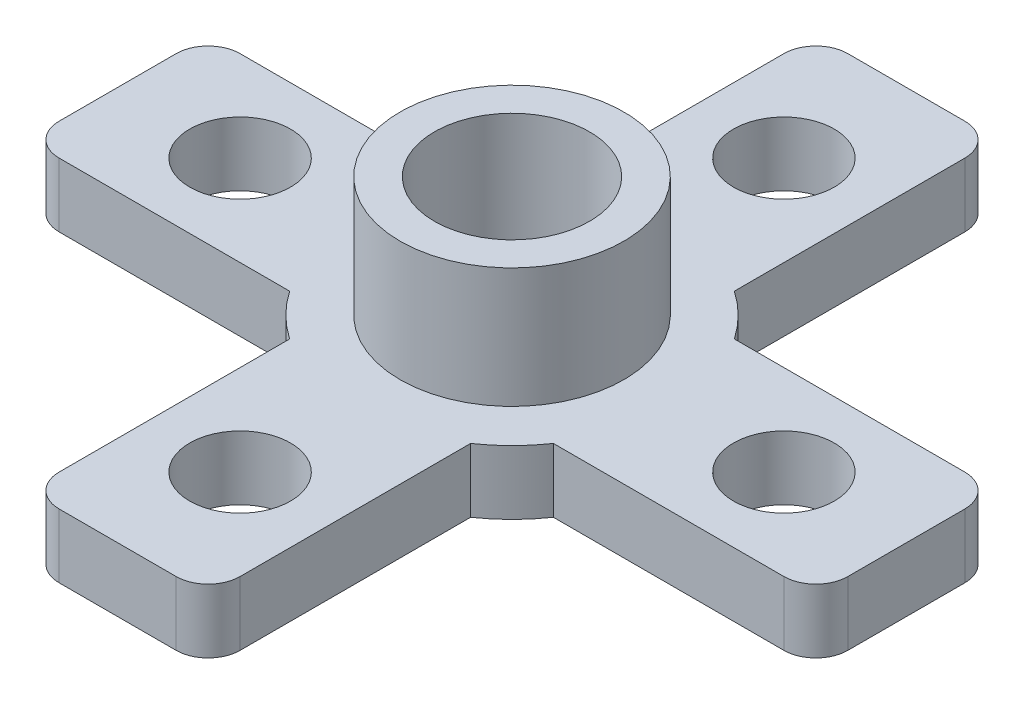
ISO-10303-21;
HEADER;
FILE_DESCRIPTION(('STEP AP214'),'2;1');
FILE_NAME('part.step','',(''),(''),'','','');
FILE_SCHEMA(('AUTOMOTIVE_DESIGN { 1 0 10303 214 1 1 1 1 }'));
ENDSEC;
DATA;
#1=APPLICATION_CONTEXT('core data for automotive mechanical design processes');
#2=APPLICATION_PROTOCOL_DEFINITION('international standard','automotive_design',2000,#1);
#3=PRODUCT_CONTEXT('',#1,'mechanical');
#4=PRODUCT('Part','Part','',(#3));
#5=PRODUCT_RELATED_PRODUCT_CATEGORY('part','',(#4));
#6=PRODUCT_DEFINITION_FORMATION('','',#4);
#7=PRODUCT_DEFINITION_CONTEXT('part definition',#1,'design');
#8=PRODUCT_DEFINITION('design','',#6,#7);
#9=PRODUCT_DEFINITION_SHAPE('','',#8);
#10=(LENGTH_UNIT() NAMED_UNIT(*) SI_UNIT(.MILLI.,.METRE.));
#11=(NAMED_UNIT(*) PLANE_ANGLE_UNIT() SI_UNIT($,.RADIAN.));
#12=(NAMED_UNIT(*) SI_UNIT($,.STERADIAN.) SOLID_ANGLE_UNIT());
#13=UNCERTAINTY_MEASURE_WITH_UNIT(LENGTH_MEASURE(1.E-05),#10,'distance_accuracy_value','');
#14=(GEOMETRIC_REPRESENTATION_CONTEXT(3) GLOBAL_UNCERTAINTY_ASSIGNED_CONTEXT((#13)) GLOBAL_UNIT_ASSIGNED_CONTEXT((#10,
#11,#12)) REPRESENTATION_CONTEXT('',''));
#15=CARTESIAN_POINT('',(0.,0.,0.));
#16=DIRECTION('',(0.,0.,1.));
#17=DIRECTION('',(1.,0.,0.));
#18=AXIS2_PLACEMENT_3D('',#15,#16,#17);
#19=CARTESIAN_POINT('',(0.,2.,0.));
#20=DIRECTION('',(0.,-1.,0.));
#21=DIRECTION('',(0.,0.,-1.));
#22=AXIS2_PLACEMENT_3D('',#19,#20,#21);
#23=CYLINDRICAL_SURFACE('',#22,3.);
#24=CARTESIAN_POINT('',(0.,1.,0.));
#25=DIRECTION('',(0.,1.,0.));
#26=DIRECTION('',(0.,0.,1.));
#27=AXIS2_PLACEMENT_3D('',#24,#25,#26);
#28=CIRCLE('',#27,3.);
#29=CARTESIAN_POINT('',(0.,1.,3.));
#30=VERTEX_POINT('',#29);
#31=EDGE_CURVE('E108',#30,#30,#28,.T.);
#32=ORIENTED_EDGE('',*,*,#31,.T.);
#33=EDGE_LOOP('',(#32));
#34=FACE_BOUND('',#33,.T.);
#35=CARTESIAN_POINT('',(0.,2.,0.));
#36=DIRECTION('',(0.,1.,0.));
#37=DIRECTION('',(0.,0.,1.));
#38=AXIS2_PLACEMENT_3D('',#35,#36,#37);
#39=CIRCLE('',#38,3.);
#40=CARTESIAN_POINT('',(0.,2.,3.));
#41=VERTEX_POINT('',#40);
#42=EDGE_CURVE('E104',#41,#41,#39,.T.);
#43=ORIENTED_EDGE('',*,*,#42,.F.);
#44=EDGE_LOOP('',(#43));
#45=FACE_BOUND('',#44,.T.);
#46=ADVANCED_FACE('F98',(#34,#45),#23,.T.);
#47=CARTESIAN_POINT('',(0.,2.,0.));
#48=DIRECTION('',(0.,-1.,0.));
#49=DIRECTION('',(0.,0.,-1.));
#50=AXIS2_PLACEMENT_3D('',#47,#48,#49);
#51=CYLINDRICAL_SURFACE('',#50,1.125);
#52=CARTESIAN_POINT('',(0.,1.,0.));
#53=DIRECTION('',(0.,1.,0.));
#54=DIRECTION('',(0.,0.,1.));
#55=AXIS2_PLACEMENT_3D('',#52,#53,#54);
#56=CIRCLE('',#55,1.125);
#57=CARTESIAN_POINT('',(0.,1.,1.125));
#58=VERTEX_POINT('',#57);
#59=EDGE_CURVE('E112',#58,#58,#56,.T.);
#60=ORIENTED_EDGE('',*,*,#59,.F.);
#61=EDGE_LOOP('',(#60));
#62=FACE_BOUND('',#61,.T.);
#63=CARTESIAN_POINT('',(0.,2.,0.));
#64=DIRECTION('',(0.,1.,0.));
#65=DIRECTION('',(0.,0.,1.));
#66=AXIS2_PLACEMENT_3D('',#63,#64,#65);
#67=CIRCLE('',#66,1.125);
#68=CARTESIAN_POINT('',(0.,2.,1.125));
#69=VERTEX_POINT('',#68);
#70=EDGE_CURVE('E12',#69,#69,#67,.T.);
#71=ORIENTED_EDGE('',*,*,#70,.T.);
#72=EDGE_LOOP('',(#71));
#73=FACE_BOUND('',#72,.T.);
#74=ADVANCED_FACE('F121',(#62,#73),#51,.F.);
#75=CARTESIAN_POINT('',(0.,2.,0.));
#76=DIRECTION('',(0.,1.,0.));
#77=DIRECTION('',(0.,0.,1.));
#78=AXIS2_PLACEMENT_3D('',#75,#76,#77);
#79=PLANE('',#78);
#80=ORIENTED_EDGE('',*,*,#42,.T.);
#81=EDGE_LOOP('',(#80));
#82=FACE_BOUND('',#81,.T.);
#83=ORIENTED_EDGE('',*,*,#70,.F.);
#84=EDGE_LOOP('',(#83));
#85=FACE_BOUND('',#84,.T.);
#86=ADVANCED_FACE('F123',(#82,#85),#79,.T.);
#87=CARTESIAN_POINT('',(0.,1.,0.));
#88=DIRECTION('',(0.,1.,0.));
#89=DIRECTION('',(0.,0.,1.));
#90=AXIS2_PLACEMENT_3D('',#87,#88,#89);
#91=PLANE('',#90);
#92=ORIENTED_EDGE('',*,*,#59,.T.);
#93=EDGE_LOOP('',(#92));
#94=FACE_BOUND('',#93,.T.);
#95=ORIENTED_EDGE('',*,*,#31,.F.);
#96=EDGE_LOOP('',(#95));
#97=FACE_BOUND('',#96,.T.);
#98=ADVANCED_FACE('F118',(#94,#97),#91,.F.);
#99=CLOSED_SHELL('',(#46,#74,#86,#98));
#100=MANIFOLD_SOLID_BREP('B2',#99);
#101=CARTESIAN_POINT('',(0.,2.,0.));
#102=DIRECTION('',(0.,-1.,0.));
#103=DIRECTION('',(0.,0.,-1.));
#104=AXIS2_PLACEMENT_3D('',#101,#102,#103);
#105=CYLINDRICAL_SURFACE('',#104,5.);
#106=CARTESIAN_POINT('',(0.,0.,0.));
#107=DIRECTION('',(0.,1.,0.));
#108=DIRECTION('',(0.,0.,1.));
#109=AXIS2_PLACEMENT_3D('',#106,#107,#108);
#110=CIRCLE('',#109,5.);
#111=CARTESIAN_POINT('',(-2.82842712474619,0.,-4.12310562561766));
#112=VERTEX_POINT('',#111);
#113=CARTESIAN_POINT('',(-4.12310562561766,0.,-2.82842712474619));
#114=VERTEX_POINT('',#113);
#115=EDGE_CURVE('E385',#112,#114,#110,.T.);
#116=ORIENTED_EDGE('',*,*,#115,.T.);
#117=DIRECTION('',(0.,-1.,0.));
#118=VECTOR('',#117,1.);
#119=CARTESIAN_POINT('',(-4.12310562561766,2.,-2.82842712474619));
#120=LINE('',#119,#118);
#121=CARTESIAN_POINT('',(-4.12310562561766,2.,-2.82842712474619));
#122=VERTEX_POINT('',#121);
#123=EDGE_CURVE('E368',#122,#114,#120,.T.);
#124=ORIENTED_EDGE('',*,*,#123,.F.);
#125=CARTESIAN_POINT('',(0.,2.,0.));
#126=DIRECTION('',(0.,1.,0.));
#127=DIRECTION('',(0.,0.,1.));
#128=AXIS2_PLACEMENT_3D('',#125,#126,#127);
#129=CIRCLE('',#128,5.);
#130=CARTESIAN_POINT('',(-2.82842712474619,2.,-4.12310562561766));
#131=VERTEX_POINT('',#130);
#132=EDGE_CURVE('E374',#131,#122,#129,.T.);
#133=ORIENTED_EDGE('',*,*,#132,.F.);
#134=DIRECTION('',(0.,-1.,0.));
#135=VECTOR('',#134,1.);
#136=CARTESIAN_POINT('',(-2.82842712474619,2.,-4.12310562561766));
#137=LINE('',#136,#135);
#138=EDGE_CURVE('E525',#131,#112,#137,.T.);
#139=ORIENTED_EDGE('',*,*,#138,.T.);
#140=EDGE_LOOP('',(#116,#124,#133,#139));
#141=FACE_BOUND('',#140,.T.);
#142=ADVANCED_FACE('F199',(#141),#105,.T.);
#143=CARTESIAN_POINT('',(0.,2.,-2.82842712474619));
#144=DIRECTION('',(0.,0.,-1.));
#145=DIRECTION('',(-1.,0.,0.));
#146=AXIS2_PLACEMENT_3D('',#143,#144,#145);
#147=PLANE('',#146);
#148=DIRECTION('',(1.,0.,0.));
#149=VECTOR('',#148,1.);
#150=CARTESIAN_POINT('',(0.,0.,-2.82842712474619));
#151=LINE('',#150,#149);
#152=CARTESIAN_POINT('',(-11.3284271247462,0.,-2.82842712474619));
#153=VERTEX_POINT('',#152);
#154=EDGE_CURVE('E559',#153,#114,#151,.T.);
#155=ORIENTED_EDGE('',*,*,#154,.F.);
#156=DIRECTION('',(0.,-1.,0.));
#157=VECTOR('',#156,1.);
#158=CARTESIAN_POINT('',(-11.3284271247462,2.,-2.82842712474619));
#159=LINE('',#158,#157);
#160=CARTESIAN_POINT('',(-11.3284271247462,2.,-2.82842712474619));
#161=VERTEX_POINT('',#160);
#162=EDGE_CURVE('E371',#153,#161,#159,.F.);
#163=ORIENTED_EDGE('',*,*,#162,.T.);
#164=DIRECTION('',(1.,0.,0.));
#165=VECTOR('',#164,1.);
#166=CARTESIAN_POINT('',(0.,2.,-2.82842712474619));
#167=LINE('',#166,#165);
#168=EDGE_CURVE('E363',#161,#122,#167,.T.);
#169=ORIENTED_EDGE('',*,*,#168,.T.);
#170=ORIENTED_EDGE('',*,*,#123,.T.);
#171=EDGE_LOOP('',(#155,#163,#169,#170));
#172=FACE_BOUND('',#171,.T.);
#173=ADVANCED_FACE('F366',(#172),#147,.T.);
#174=CARTESIAN_POINT('',(-12.3284271247462,2.,0.));
#175=DIRECTION('',(-1.,0.,0.));
#176=DIRECTION('',(0.,0.,1.));
#177=AXIS2_PLACEMENT_3D('',#174,#175,#176);
#178=PLANE('',#177);
#179=DIRECTION('',(0.,0.,-1.));
#180=VECTOR('',#179,1.);
#181=CARTESIAN_POINT('',(-12.3284271247462,2.,0.));
#182=LINE('',#181,#180);
#183=CARTESIAN_POINT('',(-12.3284271247462,2.,1.82842712474619));
#184=VERTEX_POINT('',#183);
#185=CARTESIAN_POINT('',(-12.3284271247462,2.,-1.82842712474619));
#186=VERTEX_POINT('',#185);
#187=EDGE_CURVE('E373',#184,#186,#182,.T.);
#188=ORIENTED_EDGE('',*,*,#187,.T.);
#189=DIRECTION('',(0.,-1.,0.));
#190=VECTOR('',#189,1.);
#191=CARTESIAN_POINT('',(-12.3284271247462,2.,-1.82842712474619));
#192=LINE('',#191,#190);
#193=CARTESIAN_POINT('',(-12.3284271247462,0.,-1.82842712474619));
#194=VERTEX_POINT('',#193);
#195=EDGE_CURVE('E442',#186,#194,#192,.T.);
#196=ORIENTED_EDGE('',*,*,#195,.T.);
#197=DIRECTION('',(0.,0.,-1.));
#198=VECTOR('',#197,1.);
#199=CARTESIAN_POINT('',(-12.3284271247462,0.,0.));
#200=LINE('',#199,#198);
#201=CARTESIAN_POINT('',(-12.3284271247462,0.,1.82842712474619));
#202=VERTEX_POINT('',#201);
#203=EDGE_CURVE('E554',#202,#194,#200,.T.);
#204=ORIENTED_EDGE('',*,*,#203,.F.);
#205=DIRECTION('',(0.,-1.,0.));
#206=VECTOR('',#205,1.);
#207=CARTESIAN_POINT('',(-12.3284271247462,2.,1.82842712474619));
#208=LINE('',#207,#206);
#209=EDGE_CURVE('E440',#202,#184,#208,.F.);
#210=ORIENTED_EDGE('',*,*,#209,.T.);
#211=EDGE_LOOP('',(#188,#196,#204,#210));
#212=FACE_BOUND('',#211,.T.);
#213=ADVANCED_FACE('F647',(#212),#178,.T.);
#214=CARTESIAN_POINT('',(0.,2.,2.82842712474619));
#215=DIRECTION('',(0.,0.,1.));
#216=DIRECTION('',(1.,0.,0.));
#217=AXIS2_PLACEMENT_3D('',#214,#215,#216);
#218=PLANE('',#217);
#219=DIRECTION('',(-1.,0.,0.));
#220=VECTOR('',#219,1.);
#221=CARTESIAN_POINT('',(0.,2.,2.82842712474619));
#222=LINE('',#221,#220);
#223=CARTESIAN_POINT('',(-4.12310562561766,2.,2.82842712474619));
#224=VERTEX_POINT('',#223);
#225=CARTESIAN_POINT('',(-11.3284271247462,2.,2.82842712474619));
#226=VERTEX_POINT('',#225);
#227=EDGE_CURVE('E600',#224,#226,#222,.T.);
#228=ORIENTED_EDGE('',*,*,#227,.T.);
#229=DIRECTION('',(0.,-1.,0.));
#230=VECTOR('',#229,1.);
#231=CARTESIAN_POINT('',(-11.3284271247462,2.,2.82842712474619));
#232=LINE('',#231,#230);
#233=CARTESIAN_POINT('',(-11.3284271247462,0.,2.82842712474619));
#234=VERTEX_POINT('',#233);
#235=EDGE_CURVE('E446',#226,#234,#232,.T.);
#236=ORIENTED_EDGE('',*,*,#235,.T.);
#237=DIRECTION('',(-1.,0.,0.));
#238=VECTOR('',#237,1.);
#239=CARTESIAN_POINT('',(0.,0.,2.82842712474619));
#240=LINE('',#239,#238);
#241=CARTESIAN_POINT('',(-4.12310562561766,0.,2.82842712474619));
#242=VERTEX_POINT('',#241);
#243=EDGE_CURVE('E552',#242,#234,#240,.T.);
#244=ORIENTED_EDGE('',*,*,#243,.F.);
#245=DIRECTION('',(0.,-1.,0.));
#246=VECTOR('',#245,1.);
#247=CARTESIAN_POINT('',(-4.12310562561766,2.,2.82842712474619));
#248=LINE('',#247,#246);
#249=EDGE_CURVE('E387',#224,#242,#248,.T.);
#250=ORIENTED_EDGE('',*,*,#249,.F.);
#251=EDGE_LOOP('',(#228,#236,#244,#250));
#252=FACE_BOUND('',#251,.T.);
#253=ADVANCED_FACE('F683',(#252),#218,.T.);
#254=CARTESIAN_POINT('',(0.,2.,0.));
#255=DIRECTION('',(0.,-1.,0.));
#256=DIRECTION('',(0.,0.,-1.));
#257=AXIS2_PLACEMENT_3D('',#254,#255,#256);
#258=CYLINDRICAL_SURFACE('',#257,5.);
#259=CARTESIAN_POINT('',(0.,0.,0.));
#260=DIRECTION('',(0.,1.,0.));
#261=DIRECTION('',(0.,0.,1.));
#262=AXIS2_PLACEMENT_3D('',#259,#260,#261);
#263=CIRCLE('',#262,5.);
#264=CARTESIAN_POINT('',(-2.82842712474619,0.,4.12310562561766));
#265=VERTEX_POINT('',#264);
#266=EDGE_CURVE('E548',#242,#265,#263,.T.);
#267=ORIENTED_EDGE('',*,*,#266,.T.);
#268=DIRECTION('',(0.,-1.,0.));
#269=VECTOR('',#268,1.);
#270=CARTESIAN_POINT('',(-2.82842712474619,2.,4.12310562561766));
#271=LINE('',#270,#269);
#272=CARTESIAN_POINT('',(-2.82842712474619,2.,4.12310562561766));
#273=VERTEX_POINT('',#272);
#274=EDGE_CURVE('E391',#273,#265,#271,.T.);
#275=ORIENTED_EDGE('',*,*,#274,.F.);
#276=CARTESIAN_POINT('',(0.,2.,0.));
#277=DIRECTION('',(0.,1.,0.));
#278=DIRECTION('',(0.,0.,1.));
#279=AXIS2_PLACEMENT_3D('',#276,#277,#278);
#280=CIRCLE('',#279,5.);
#281=EDGE_CURVE('E598',#224,#273,#280,.T.);
#282=ORIENTED_EDGE('',*,*,#281,.F.);
#283=ORIENTED_EDGE('',*,*,#249,.T.);
#284=EDGE_LOOP('',(#267,#275,#282,#283));
#285=FACE_BOUND('',#284,.T.);
#286=ADVANCED_FACE('F549',(#285),#258,.T.);
#287=CARTESIAN_POINT('',(-2.82842712474619,2.,0.));
#288=DIRECTION('',(-1.,0.,0.));
#289=DIRECTION('',(0.,0.,1.));
#290=AXIS2_PLACEMENT_3D('',#287,#288,#289);
#291=PLANE('',#290);
#292=DIRECTION('',(0.,0.,-1.));
#293=VECTOR('',#292,1.);
#294=CARTESIAN_POINT('',(-2.82842712474619,0.,0.));
#295=LINE('',#294,#293);
#296=CARTESIAN_POINT('',(-2.82842712474619,0.,11.3284271247462));
#297=VERTEX_POINT('',#296);
#298=EDGE_CURVE('E493',#297,#265,#295,.T.);
#299=ORIENTED_EDGE('',*,*,#298,.F.);
#300=DIRECTION('',(0.,-1.,0.));
#301=VECTOR('',#300,1.);
#302=CARTESIAN_POINT('',(-2.82842712474619,2.,11.3284271247462));
#303=LINE('',#302,#301);
#304=CARTESIAN_POINT('',(-2.82842712474619,2.,11.3284271247462));
#305=VERTEX_POINT('',#304);
#306=EDGE_CURVE('E96',#297,#305,#303,.F.);
#307=ORIENTED_EDGE('',*,*,#306,.T.);
#308=DIRECTION('',(0.,0.,-1.));
#309=VECTOR('',#308,1.);
#310=CARTESIAN_POINT('',(-2.82842712474619,2.,0.));
#311=LINE('',#310,#309);
#312=EDGE_CURVE('E474',#305,#273,#311,.T.);
#313=ORIENTED_EDGE('',*,*,#312,.T.);
#314=ORIENTED_EDGE('',*,*,#274,.T.);
#315=EDGE_LOOP('',(#299,#307,#313,#314));
#316=FACE_BOUND('',#315,.T.);
#317=ADVANCED_FACE('F542',(#316),#291,.T.);
#318=CARTESIAN_POINT('',(0.,2.,12.3284271247462));
#319=DIRECTION('',(0.,0.,1.));
#320=DIRECTION('',(1.,0.,0.));
#321=AXIS2_PLACEMENT_3D('',#318,#319,#320);
#322=PLANE('',#321);
#323=DIRECTION('',(-1.,0.,0.));
#324=VECTOR('',#323,1.);
#325=CARTESIAN_POINT('',(0.,0.,12.3284271247462));
#326=LINE('',#325,#324);
#327=CARTESIAN_POINT('',(1.82842712474619,0.,12.3284271247462));
#328=VERTEX_POINT('',#327);
#329=CARTESIAN_POINT('',(-1.82842712474619,0.,12.3284271247462));
#330=VERTEX_POINT('',#329);
#331=EDGE_CURVE('E466',#328,#330,#326,.T.);
#332=ORIENTED_EDGE('',*,*,#331,.F.);
#333=DIRECTION('',(0.,-1.,0.));
#334=VECTOR('',#333,1.);
#335=CARTESIAN_POINT('',(1.82842712474619,2.,12.3284271247462));
#336=LINE('',#335,#334);
#337=CARTESIAN_POINT('',(1.82842712474619,2.,12.3284271247462));
#338=VERTEX_POINT('',#337);
#339=EDGE_CURVE('E208',#328,#338,#336,.F.);
#340=ORIENTED_EDGE('',*,*,#339,.T.);
#341=DIRECTION('',(-1.,0.,0.));
#342=VECTOR('',#341,1.);
#343=CARTESIAN_POINT('',(0.,2.,12.3284271247462));
#344=LINE('',#343,#342);
#345=CARTESIAN_POINT('',(-1.82842712474619,2.,12.3284271247462));
#346=VERTEX_POINT('',#345);
#347=EDGE_CURVE('E463',#338,#346,#344,.T.);
#348=ORIENTED_EDGE('',*,*,#347,.T.);
#349=DIRECTION('',(0.,-1.,0.));
#350=VECTOR('',#349,1.);
#351=CARTESIAN_POINT('',(-1.82842712474619,2.,12.3284271247462));
#352=LINE('',#351,#350);
#353=EDGE_CURVE('E454',#346,#330,#352,.T.);
#354=ORIENTED_EDGE('',*,*,#353,.T.);
#355=EDGE_LOOP('',(#332,#340,#348,#354));
#356=FACE_BOUND('',#355,.T.);
#357=ADVANCED_FACE('F462',(#356),#322,.T.);
#358=CARTESIAN_POINT('',(2.82842712474619,2.,0.));
#359=DIRECTION('',(1.,0.,0.));
#360=DIRECTION('',(0.,0.,-1.));
#361=AXIS2_PLACEMENT_3D('',#358,#359,#360);
#362=PLANE('',#361);
#363=DIRECTION('',(0.,0.,1.));
#364=VECTOR('',#363,1.);
#365=CARTESIAN_POINT('',(2.82842712474619,2.,0.));
#366=LINE('',#365,#364);
#367=CARTESIAN_POINT('',(2.82842712474619,2.,4.12310562561766));
#368=VERTEX_POINT('',#367);
#369=CARTESIAN_POINT('',(2.82842712474619,2.,11.3284271247462));
#370=VERTEX_POINT('',#369);
#371=EDGE_CURVE('E473',#368,#370,#366,.T.);
#372=ORIENTED_EDGE('',*,*,#371,.T.);
#373=DIRECTION('',(0.,-1.,0.));
#374=VECTOR('',#373,1.);
#375=CARTESIAN_POINT('',(2.82842712474619,2.,11.3284271247462));
#376=LINE('',#375,#374);
#377=CARTESIAN_POINT('',(2.82842712474619,0.,11.3284271247462));
#378=VERTEX_POINT('',#377);
#379=EDGE_CURVE('E451',#370,#378,#376,.T.);
#380=ORIENTED_EDGE('',*,*,#379,.T.);
#381=DIRECTION('',(0.,0.,1.));
#382=VECTOR('',#381,1.);
#383=CARTESIAN_POINT('',(2.82842712474619,0.,0.));
#384=LINE('',#383,#382);
#385=CARTESIAN_POINT('',(2.82842712474619,0.,4.12310562561766));
#386=VERTEX_POINT('',#385);
#387=EDGE_CURVE('E482',#386,#378,#384,.T.);
#388=ORIENTED_EDGE('',*,*,#387,.F.);
#389=DIRECTION('',(0.,-1.,0.));
#390=VECTOR('',#389,1.);
#391=CARTESIAN_POINT('',(2.82842712474619,2.,4.12310562561766));
#392=LINE('',#391,#390);
#393=EDGE_CURVE('E536',#368,#386,#392,.T.);
#394=ORIENTED_EDGE('',*,*,#393,.F.);
#395=EDGE_LOOP('',(#372,#380,#388,#394));
#396=FACE_BOUND('',#395,.T.);
#397=ADVANCED_FACE('F481',(#396),#362,.T.);
#398=CARTESIAN_POINT('',(0.,2.,0.));
#399=DIRECTION('',(0.,-1.,0.));
#400=DIRECTION('',(0.,0.,-1.));
#401=AXIS2_PLACEMENT_3D('',#398,#399,#400);
#402=CYLINDRICAL_SURFACE('',#401,5.);
#403=CARTESIAN_POINT('',(0.,0.,0.));
#404=DIRECTION('',(0.,1.,0.));
#405=DIRECTION('',(0.,0.,1.));
#406=AXIS2_PLACEMENT_3D('',#403,#404,#405);
#407=CIRCLE('',#406,5.);
#408=CARTESIAN_POINT('',(4.12310562561766,0.,2.82842712474619));
#409=VERTEX_POINT('',#408);
#410=EDGE_CURVE('E489',#386,#409,#407,.T.);
#411=ORIENTED_EDGE('',*,*,#410,.T.);
#412=DIRECTION('',(0.,-1.,0.));
#413=VECTOR('',#412,1.);
#414=CARTESIAN_POINT('',(4.12310562561766,2.,2.82842712474619));
#415=LINE('',#414,#413);
#416=CARTESIAN_POINT('',(4.12310562561766,2.,2.82842712474619));
#417=VERTEX_POINT('',#416);
#418=EDGE_CURVE('E533',#417,#409,#415,.T.);
#419=ORIENTED_EDGE('',*,*,#418,.F.);
#420=CARTESIAN_POINT('',(0.,2.,0.));
#421=DIRECTION('',(0.,1.,0.));
#422=DIRECTION('',(0.,0.,1.));
#423=AXIS2_PLACEMENT_3D('',#420,#421,#422);
#424=CIRCLE('',#423,5.);
#425=EDGE_CURVE('E593',#368,#417,#424,.T.);
#426=ORIENTED_EDGE('',*,*,#425,.F.);
#427=ORIENTED_EDGE('',*,*,#393,.T.);
#428=EDGE_LOOP('',(#411,#419,#426,#427));
#429=FACE_BOUND('',#428,.T.);
#430=ADVANCED_FACE('F725',(#429),#402,.T.);
#431=CARTESIAN_POINT('',(0.,2.,2.82842712474619));
#432=DIRECTION('',(0.,0.,1.));
#433=DIRECTION('',(1.,0.,0.));
#434=AXIS2_PLACEMENT_3D('',#431,#432,#433);
#435=PLANE('',#434);
#436=DIRECTION('',(-1.,0.,0.));
#437=VECTOR('',#436,1.);
#438=CARTESIAN_POINT('',(0.,0.,2.82842712474619));
#439=LINE('',#438,#437);
#440=CARTESIAN_POINT('',(11.3284271247462,0.,2.82842712474619));
#441=VERTEX_POINT('',#440);
#442=EDGE_CURVE('E491',#441,#409,#439,.T.);
#443=ORIENTED_EDGE('',*,*,#442,.F.);
#444=DIRECTION('',(0.,-1.,0.));
#445=VECTOR('',#444,1.);
#446=CARTESIAN_POINT('',(11.3284271247462,2.,2.82842712474619));
#447=LINE('',#446,#445);
#448=CARTESIAN_POINT('',(11.3284271247462,2.,2.82842712474619));
#449=VERTEX_POINT('',#448);
#450=EDGE_CURVE('E449',#441,#449,#447,.F.);
#451=ORIENTED_EDGE('',*,*,#450,.T.);
#452=DIRECTION('',(-1.,0.,0.));
#453=VECTOR('',#452,1.);
#454=CARTESIAN_POINT('',(0.,2.,2.82842712474619));
#455=LINE('',#454,#453);
#456=EDGE_CURVE('E591',#449,#417,#455,.T.);
#457=ORIENTED_EDGE('',*,*,#456,.T.);
#458=ORIENTED_EDGE('',*,*,#418,.T.);
#459=EDGE_LOOP('',(#443,#451,#457,#458));
#460=FACE_BOUND('',#459,.T.);
#461=ADVANCED_FACE('F720',(#460),#435,.T.);
#462=CARTESIAN_POINT('',(12.3284271247462,2.,0.));
#463=DIRECTION('',(1.,0.,0.));
#464=DIRECTION('',(0.,0.,-1.));
#465=AXIS2_PLACEMENT_3D('',#462,#463,#464);
#466=PLANE('',#465);
#467=DIRECTION('',(0.,0.,1.));
#468=VECTOR('',#467,1.);
#469=CARTESIAN_POINT('',(12.3284271247462,0.,0.));
#470=LINE('',#469,#468);
#471=CARTESIAN_POINT('',(12.3284271247462,0.,-1.82842712474619));
#472=VERTEX_POINT('',#471);
#473=CARTESIAN_POINT('',(12.3284271247462,0.,1.82842712474619));
#474=VERTEX_POINT('',#473);
#475=EDGE_CURVE('E498',#472,#474,#470,.T.);
#476=ORIENTED_EDGE('',*,*,#475,.F.);
#477=DIRECTION('',(0.,-1.,0.));
#478=VECTOR('',#477,1.);
#479=CARTESIAN_POINT('',(12.3284271247462,2.,-1.82842712474619));
#480=LINE('',#479,#478);
#481=CARTESIAN_POINT('',(12.3284271247462,2.,-1.82842712474619));
#482=VERTEX_POINT('',#481);
#483=EDGE_CURVE('E435',#472,#482,#480,.F.);
#484=ORIENTED_EDGE('',*,*,#483,.T.);
#485=DIRECTION('',(0.,0.,1.));
#486=VECTOR('',#485,1.);
#487=CARTESIAN_POINT('',(12.3284271247462,2.,0.));
#488=LINE('',#487,#486);
#489=CARTESIAN_POINT('',(12.3284271247462,2.,1.82842712474619));
#490=VERTEX_POINT('',#489);
#491=EDGE_CURVE('E588',#482,#490,#488,.T.);
#492=ORIENTED_EDGE('',*,*,#491,.T.);
#493=DIRECTION('',(0.,-1.,0.));
#494=VECTOR('',#493,1.);
#495=CARTESIAN_POINT('',(12.3284271247462,2.,1.82842712474619));
#496=LINE('',#495,#494);
#497=EDGE_CURVE('E432',#490,#474,#496,.T.);
#498=ORIENTED_EDGE('',*,*,#497,.T.);
#499=EDGE_LOOP('',(#476,#484,#492,#498));
#500=FACE_BOUND('',#499,.T.);
#501=ADVANCED_FACE('F714',(#500),#466,.T.);
#502=CARTESIAN_POINT('',(0.,2.,-2.82842712474619));
#503=DIRECTION('',(0.,0.,-1.));
#504=DIRECTION('',(-1.,0.,0.));
#505=AXIS2_PLACEMENT_3D('',#502,#503,#504);
#506=PLANE('',#505);
#507=DIRECTION('',(1.,0.,0.));
#508=VECTOR('',#507,1.);
#509=CARTESIAN_POINT('',(0.,2.,-2.82842712474619));
#510=LINE('',#509,#508);
#511=CARTESIAN_POINT('',(4.12310562561766,2.,-2.82842712474619));
#512=VERTEX_POINT('',#511);
#513=CARTESIAN_POINT('',(11.3284271247462,2.,-2.82842712474619));
#514=VERTEX_POINT('',#513);
#515=EDGE_CURVE('E586',#512,#514,#510,.T.);
#516=ORIENTED_EDGE('',*,*,#515,.T.);
#517=DIRECTION('',(0.,-1.,0.));
#518=VECTOR('',#517,1.);
#519=CARTESIAN_POINT('',(11.3284271247462,2.,-2.82842712474619));
#520=LINE('',#519,#518);
#521=CARTESIAN_POINT('',(11.3284271247462,0.,-2.82842712474619));
#522=VERTEX_POINT('',#521);
#523=EDGE_CURVE('E429',#514,#522,#520,.T.);
#524=ORIENTED_EDGE('',*,*,#523,.T.);
#525=DIRECTION('',(1.,0.,0.));
#526=VECTOR('',#525,1.);
#527=CARTESIAN_POINT('',(0.,0.,-2.82842712474619));
#528=LINE('',#527,#526);
#529=CARTESIAN_POINT('',(4.12310562561766,0.,-2.82842712474619));
#530=VERTEX_POINT('',#529);
#531=EDGE_CURVE('E501',#530,#522,#528,.T.);
#532=ORIENTED_EDGE('',*,*,#531,.F.);
#533=DIRECTION('',(0.,-1.,0.));
#534=VECTOR('',#533,1.);
#535=CARTESIAN_POINT('',(4.12310562561766,2.,-2.82842712474619));
#536=LINE('',#535,#534);
#537=EDGE_CURVE('E531',#512,#530,#536,.T.);
#538=ORIENTED_EDGE('',*,*,#537,.F.);
#539=EDGE_LOOP('',(#516,#524,#532,#538));
#540=FACE_BOUND('',#539,.T.);
#541=ADVANCED_FACE('F709',(#540),#506,.T.);
#542=CARTESIAN_POINT('',(0.,2.,0.));
#543=DIRECTION('',(0.,-1.,0.));
#544=DIRECTION('',(0.,0.,-1.));
#545=AXIS2_PLACEMENT_3D('',#542,#543,#544);
#546=CYLINDRICAL_SURFACE('',#545,5.);
#547=CARTESIAN_POINT('',(0.,0.,0.));
#548=DIRECTION('',(0.,1.,0.));
#549=DIRECTION('',(0.,0.,1.));
#550=AXIS2_PLACEMENT_3D('',#547,#548,#549);
#551=CIRCLE('',#550,5.);
#552=CARTESIAN_POINT('',(2.82842712474619,0.,-4.12310562561766));
#553=VERTEX_POINT('',#552);
#554=EDGE_CURVE('E504',#530,#553,#551,.T.);
#555=ORIENTED_EDGE('',*,*,#554,.T.);
#556=DIRECTION('',(0.,-1.,0.));
#557=VECTOR('',#556,1.);
#558=CARTESIAN_POINT('',(2.82842712474619,2.,-4.12310562561766));
#559=LINE('',#558,#557);
#560=CARTESIAN_POINT('',(2.82842712474619,2.,-4.12310562561766));
#561=VERTEX_POINT('',#560);
#562=EDGE_CURVE('E527',#561,#553,#559,.T.);
#563=ORIENTED_EDGE('',*,*,#562,.F.);
#564=CARTESIAN_POINT('',(0.,2.,0.));
#565=DIRECTION('',(0.,1.,0.));
#566=DIRECTION('',(0.,0.,1.));
#567=AXIS2_PLACEMENT_3D('',#564,#565,#566);
#568=CIRCLE('',#567,5.);
#569=EDGE_CURVE('E583',#512,#561,#568,.T.);
#570=ORIENTED_EDGE('',*,*,#569,.F.);
#571=ORIENTED_EDGE('',*,*,#537,.T.);
#572=EDGE_LOOP('',(#555,#563,#570,#571));
#573=FACE_BOUND('',#572,.T.);
#574=ADVANCED_FACE('F706',(#573),#546,.T.);
#575=CARTESIAN_POINT('',(2.82842712474619,2.,0.));
#576=DIRECTION('',(1.,0.,0.));
#577=DIRECTION('',(0.,0.,-1.));
#578=AXIS2_PLACEMENT_3D('',#575,#576,#577);
#579=PLANE('',#578);
#580=DIRECTION('',(0.,0.,1.));
#581=VECTOR('',#580,1.);
#582=CARTESIAN_POINT('',(2.82842712474619,0.,0.));
#583=LINE('',#582,#581);
#584=CARTESIAN_POINT('',(2.82842712474619,0.,-11.3284271247462));
#585=VERTEX_POINT('',#584);
#586=EDGE_CURVE('E507',#585,#553,#583,.T.);
#587=ORIENTED_EDGE('',*,*,#586,.F.);
#588=DIRECTION('',(0.,-1.,0.));
#589=VECTOR('',#588,1.);
#590=CARTESIAN_POINT('',(2.82842712474619,2.,-11.3284271247462));
#591=LINE('',#590,#589);
#592=CARTESIAN_POINT('',(2.82842712474619,2.,-11.3284271247462));
#593=VERTEX_POINT('',#592);
#594=EDGE_CURVE('E413',#585,#593,#591,.F.);
#595=ORIENTED_EDGE('',*,*,#594,.T.);
#596=DIRECTION('',(0.,0.,1.));
#597=VECTOR('',#596,1.);
#598=CARTESIAN_POINT('',(2.82842712474619,2.,0.));
#599=LINE('',#598,#597);
#600=EDGE_CURVE('E581',#593,#561,#599,.T.);
#601=ORIENTED_EDGE('',*,*,#600,.T.);
#602=ORIENTED_EDGE('',*,*,#562,.T.);
#603=EDGE_LOOP('',(#587,#595,#601,#602));
#604=FACE_BOUND('',#603,.T.);
#605=ADVANCED_FACE('F702',(#604),#579,.T.);
#606=CARTESIAN_POINT('',(0.,2.,-12.3284271247462));
#607=DIRECTION('',(0.,0.,-1.));
#608=DIRECTION('',(-1.,0.,0.));
#609=AXIS2_PLACEMENT_3D('',#606,#607,#608);
#610=PLANE('',#609);
#611=DIRECTION('',(1.,0.,0.));
#612=VECTOR('',#611,1.);
#613=CARTESIAN_POINT('',(0.,2.,-12.3284271247462));
#614=LINE('',#613,#612);
#615=CARTESIAN_POINT('',(-1.82842712474619,2.,-12.3284271247462));
#616=VERTEX_POINT('',#615);
#617=CARTESIAN_POINT('',(1.82842712474619,2.,-12.3284271247462));
#618=VERTEX_POINT('',#617);
#619=EDGE_CURVE('E578',#616,#618,#614,.T.);
#620=ORIENTED_EDGE('',*,*,#619,.T.);
#621=DIRECTION('',(0.,-1.,0.));
#622=VECTOR('',#621,1.);
#623=CARTESIAN_POINT('',(1.82842712474619,2.,-12.3284271247462));
#624=LINE('',#623,#622);
#625=CARTESIAN_POINT('',(1.82842712474619,0.,-12.3284271247462));
#626=VERTEX_POINT('',#625);
#627=EDGE_CURVE('E389',#618,#626,#624,.T.);
#628=ORIENTED_EDGE('',*,*,#627,.T.);
#629=DIRECTION('',(1.,0.,0.));
#630=VECTOR('',#629,1.);
#631=CARTESIAN_POINT('',(0.,0.,-12.3284271247462));
#632=LINE('',#631,#630);
#633=CARTESIAN_POINT('',(-1.82842712474619,0.,-12.3284271247462));
#634=VERTEX_POINT('',#633);
#635=EDGE_CURVE('E509',#634,#626,#632,.T.);
#636=ORIENTED_EDGE('',*,*,#635,.F.);
#637=DIRECTION('',(0.,-1.,0.));
#638=VECTOR('',#637,1.);
#639=CARTESIAN_POINT('',(-1.82842712474619,2.,-12.3284271247462));
#640=LINE('',#639,#638);
#641=EDGE_CURVE('E386',#634,#616,#640,.F.);
#642=ORIENTED_EDGE('',*,*,#641,.T.);
#643=EDGE_LOOP('',(#620,#628,#636,#642));
#644=FACE_BOUND('',#643,.T.);
#645=ADVANCED_FACE('F695',(#644),#610,.T.);
#646=CARTESIAN_POINT('',(0.,2.,8.5));
#647=DIRECTION('',(0.,-1.,0.));
#648=DIRECTION('',(0.,0.,-1.));
#649=AXIS2_PLACEMENT_3D('',#646,#647,#648);
#650=CYLINDRICAL_SURFACE('',#649,1.57500000000006);
#651=CARTESIAN_POINT('',(0.,2.,8.5));
#652=DIRECTION('',(0.,1.,0.));
#653=DIRECTION('',(0.,0.,1.));
#654=AXIS2_PLACEMENT_3D('',#651,#652,#653);
#655=CIRCLE('',#654,1.57500000000006);
#656=CARTESIAN_POINT('',(0.,2.,10.0750000000001));
#657=VERTEX_POINT('',#656);
#658=EDGE_CURVE('E565',#657,#657,#655,.T.);
#659=ORIENTED_EDGE('',*,*,#658,.T.);
#660=EDGE_LOOP('',(#659));
#661=FACE_BOUND('',#660,.T.);
#662=CARTESIAN_POINT('',(0.,0.,8.5));
#663=DIRECTION('',(0.,1.,0.));
#664=DIRECTION('',(0.,0.,1.));
#665=AXIS2_PLACEMENT_3D('',#662,#663,#664);
#666=CIRCLE('',#665,1.57500000000006);
#667=CARTESIAN_POINT('',(0.,0.,10.0750000000001));
#668=VERTEX_POINT('',#667);
#669=EDGE_CURVE('E520',#668,#668,#666,.T.);
#670=ORIENTED_EDGE('',*,*,#669,.F.);
#671=EDGE_LOOP('',(#670));
#672=FACE_BOUND('',#671,.T.);
#673=ADVANCED_FACE('F809',(#661,#672),#650,.F.);
#674=CARTESIAN_POINT('',(0.,2.,-8.5));
#675=DIRECTION('',(0.,-1.,0.));
#676=DIRECTION('',(0.,0.,-1.));
#677=AXIS2_PLACEMENT_3D('',#674,#675,#676);
#678=CYLINDRICAL_SURFACE('',#677,1.575);
#679=CARTESIAN_POINT('',(0.,2.,-8.5));
#680=DIRECTION('',(0.,1.,0.));
#681=DIRECTION('',(0.,0.,1.));
#682=AXIS2_PLACEMENT_3D('',#679,#680,#681);
#683=CIRCLE('',#682,1.575);
#684=CARTESIAN_POINT('',(0.,2.,-6.925));
#685=VERTEX_POINT('',#684);
#686=EDGE_CURVE('E568',#685,#685,#683,.T.);
#687=ORIENTED_EDGE('',*,*,#686,.T.);
#688=EDGE_LOOP('',(#687));
#689=FACE_BOUND('',#688,.T.);
#690=CARTESIAN_POINT('',(0.,0.,-8.5));
#691=DIRECTION('',(0.,1.,0.));
#692=DIRECTION('',(0.,0.,1.));
#693=AXIS2_PLACEMENT_3D('',#690,#691,#692);
#694=CIRCLE('',#693,1.575);
#695=CARTESIAN_POINT('',(0.,0.,-6.925));
#696=VERTEX_POINT('',#695);
#697=EDGE_CURVE('E517',#696,#696,#694,.T.);
#698=ORIENTED_EDGE('',*,*,#697,.F.);
#699=EDGE_LOOP('',(#698));
#700=FACE_BOUND('',#699,.T.);
#701=ADVANCED_FACE('F1018',(#689,#700),#678,.F.);
#702=CARTESIAN_POINT('',(8.5,2.,0.));
#703=DIRECTION('',(0.,-1.,0.));
#704=DIRECTION('',(0.,0.,-1.));
#705=AXIS2_PLACEMENT_3D('',#702,#703,#704);
#706=CYLINDRICAL_SURFACE('',#705,1.57500000000003);
#707=CARTESIAN_POINT('',(8.5,2.,0.));
#708=DIRECTION('',(0.,1.,0.));
#709=DIRECTION('',(0.,0.,1.));
#710=AXIS2_PLACEMENT_3D('',#707,#708,#709);
#711=CIRCLE('',#710,1.57500000000003);
#712=CARTESIAN_POINT('',(8.5,2.,1.57500000000003));
#713=VERTEX_POINT('',#712);
#714=EDGE_CURVE('E571',#713,#713,#711,.T.);
#715=ORIENTED_EDGE('',*,*,#714,.T.);
#716=EDGE_LOOP('',(#715));
#717=FACE_BOUND('',#716,.T.);
#718=CARTESIAN_POINT('',(8.5,0.,0.));
#719=DIRECTION('',(0.,1.,0.));
#720=DIRECTION('',(0.,0.,1.));
#721=AXIS2_PLACEMENT_3D('',#718,#719,#720);
#722=CIRCLE('',#721,1.57500000000003);
#723=CARTESIAN_POINT('',(8.5,0.,1.57500000000003));
#724=VERTEX_POINT('',#723);
#725=EDGE_CURVE('E514',#724,#724,#722,.T.);
#726=ORIENTED_EDGE('',*,*,#725,.F.);
#727=EDGE_LOOP('',(#726));
#728=FACE_BOUND('',#727,.T.);
#729=ADVANCED_FACE('F821',(#717,#728),#706,.F.);
#730=CARTESIAN_POINT('',(-2.82842712474619,2.,0.));
#731=DIRECTION('',(-1.,0.,0.));
#732=DIRECTION('',(0.,0.,1.));
#733=AXIS2_PLACEMENT_3D('',#730,#731,#732);
#734=PLANE('',#733);
#735=DIRECTION('',(0.,0.,-1.));
#736=VECTOR('',#735,1.);
#737=CARTESIAN_POINT('',(-2.82842712474619,2.,0.));
#738=LINE('',#737,#736);
#739=CARTESIAN_POINT('',(-2.82842712474619,2.,-11.3284271247462));
#740=VERTEX_POINT('',#739);
#741=EDGE_CURVE('E380',#131,#740,#738,.T.);
#742=ORIENTED_EDGE('',*,*,#741,.T.);
#743=DIRECTION('',(0.,-1.,0.));
#744=VECTOR('',#743,1.);
#745=CARTESIAN_POINT('',(-2.82842712474619,2.,-11.3284271247462));
#746=LINE('',#745,#744);
#747=CARTESIAN_POINT('',(-2.82842712474619,0.,-11.3284271247462));
#748=VERTEX_POINT('',#747);
#749=EDGE_CURVE('E437',#740,#748,#746,.T.);
#750=ORIENTED_EDGE('',*,*,#749,.T.);
#751=DIRECTION('',(0.,0.,-1.));
#752=VECTOR('',#751,1.);
#753=CARTESIAN_POINT('',(-2.82842712474619,0.,0.));
#754=LINE('',#753,#752);
#755=EDGE_CURVE('E511',#112,#748,#754,.T.);
#756=ORIENTED_EDGE('',*,*,#755,.F.);
#757=ORIENTED_EDGE('',*,*,#138,.F.);
#758=EDGE_LOOP('',(#742,#750,#756,#757));
#759=FACE_BOUND('',#758,.T.);
#760=ADVANCED_FACE('F690',(#759),#734,.T.);
#761=CARTESIAN_POINT('',(-8.5,2.,0.));
#762=DIRECTION('',(0.,-1.,0.));
#763=DIRECTION('',(0.,0.,-1.));
#764=AXIS2_PLACEMENT_3D('',#761,#762,#763);
#765=CYLINDRICAL_SURFACE('',#764,1.57500000000009);
#766=CARTESIAN_POINT('',(-8.5,2.,0.));
#767=DIRECTION('',(0.,1.,0.));
#768=DIRECTION('',(0.,0.,1.));
#769=AXIS2_PLACEMENT_3D('',#766,#767,#768);
#770=CIRCLE('',#769,1.57500000000009);
#771=CARTESIAN_POINT('',(-8.5,2.,1.57500000000009));
#772=VERTEX_POINT('',#771);
#773=EDGE_CURVE('E528',#772,#772,#770,.T.);
#774=ORIENTED_EDGE('',*,*,#773,.T.);
#775=EDGE_LOOP('',(#774));
#776=FACE_BOUND('',#775,.T.);
#777=CARTESIAN_POINT('',(-8.5,0.,0.));
#778=DIRECTION('',(0.,1.,0.));
#779=DIRECTION('',(0.,0.,1.));
#780=AXIS2_PLACEMENT_3D('',#777,#778,#779);
#781=CIRCLE('',#780,1.57500000000009);
#782=CARTESIAN_POINT('',(-8.5,0.,1.57500000000009));
#783=VERTEX_POINT('',#782);
#784=EDGE_CURVE('E382',#783,#783,#781,.T.);
#785=ORIENTED_EDGE('',*,*,#784,.F.);
#786=EDGE_LOOP('',(#785));
#787=FACE_BOUND('',#786,.T.);
#788=ADVANCED_FACE('F820',(#776,#787),#765,.F.);
#789=CARTESIAN_POINT('',(0.,2.,0.));
#790=DIRECTION('',(0.,1.,0.));
#791=DIRECTION('',(0.,0.,1.));
#792=AXIS2_PLACEMENT_3D('',#789,#790,#791);
#793=PLANE('',#792);
#794=ORIENTED_EDGE('',*,*,#600,.F.);
#795=CARTESIAN_POINT('',(1.82842712474619,2.,-11.3284271247462));
#796=DIRECTION('',(0.,1.,0.));
#797=DIRECTION('',(0.,0.,1.));
#798=AXIS2_PLACEMENT_3D('',#795,#796,#797);
#799=CIRCLE('',#798,1.);
#800=EDGE_CURVE('E427',#593,#618,#799,.T.);
#801=ORIENTED_EDGE('',*,*,#800,.T.);
#802=ORIENTED_EDGE('',*,*,#619,.F.);
#803=CARTESIAN_POINT('',(-1.82842712474619,2.,-11.3284271247462));
#804=DIRECTION('',(0.,1.,0.));
#805=DIRECTION('',(0.,0.,1.));
#806=AXIS2_PLACEMENT_3D('',#803,#804,#805);
#807=CIRCLE('',#806,1.);
#808=EDGE_CURVE('E215',#616,#740,#807,.T.);
#809=ORIENTED_EDGE('',*,*,#808,.T.);
#810=ORIENTED_EDGE('',*,*,#741,.F.);
#811=ORIENTED_EDGE('',*,*,#132,.T.);
#812=ORIENTED_EDGE('',*,*,#168,.F.);
#813=CARTESIAN_POINT('',(-11.3284271247462,2.,-1.82842712474619));
#814=DIRECTION('',(0.,1.,0.));
#815=DIRECTION('',(0.,0.,1.));
#816=AXIS2_PLACEMENT_3D('',#813,#814,#815);
#817=CIRCLE('',#816,1.);
#818=EDGE_CURVE('E423',#161,#186,#817,.T.);
#819=ORIENTED_EDGE('',*,*,#818,.T.);
#820=ORIENTED_EDGE('',*,*,#187,.F.);
#821=CARTESIAN_POINT('',(-11.3284271247462,2.,1.82842712474619));
#822=DIRECTION('',(0.,1.,0.));
#823=DIRECTION('',(0.,0.,1.));
#824=AXIS2_PLACEMENT_3D('',#821,#822,#823);
#825=CIRCLE('',#824,1.);
#826=EDGE_CURVE('E421',#184,#226,#825,.T.);
#827=ORIENTED_EDGE('',*,*,#826,.T.);
#828=ORIENTED_EDGE('',*,*,#227,.F.);
#829=ORIENTED_EDGE('',*,*,#281,.T.);
#830=ORIENTED_EDGE('',*,*,#312,.F.);
#831=CARTESIAN_POINT('',(-1.82842712474619,2.,11.3284271247462));
#832=DIRECTION('',(0.,1.,0.));
#833=DIRECTION('',(0.,0.,1.));
#834=AXIS2_PLACEMENT_3D('',#831,#832,#833);
#835=CIRCLE('',#834,1.);
#836=EDGE_CURVE('E415',#305,#346,#835,.T.);
#837=ORIENTED_EDGE('',*,*,#836,.T.);
#838=ORIENTED_EDGE('',*,*,#347,.F.);
#839=CARTESIAN_POINT('',(1.82842712474619,2.,11.3284271247462));
#840=DIRECTION('',(0.,1.,0.));
#841=DIRECTION('',(0.,0.,1.));
#842=AXIS2_PLACEMENT_3D('',#839,#840,#841);
#843=CIRCLE('',#842,1.);
#844=EDGE_CURVE('E417',#338,#370,#843,.T.);
#845=ORIENTED_EDGE('',*,*,#844,.T.);
#846=ORIENTED_EDGE('',*,*,#371,.F.);
#847=ORIENTED_EDGE('',*,*,#425,.T.);
#848=ORIENTED_EDGE('',*,*,#456,.F.);
#849=CARTESIAN_POINT('',(11.3284271247462,2.,1.82842712474619));
#850=DIRECTION('',(0.,1.,0.));
#851=DIRECTION('',(0.,0.,1.));
#852=AXIS2_PLACEMENT_3D('',#849,#850,#851);
#853=CIRCLE('',#852,1.);
#854=EDGE_CURVE('E419',#449,#490,#853,.T.);
#855=ORIENTED_EDGE('',*,*,#854,.T.);
#856=ORIENTED_EDGE('',*,*,#491,.F.);
#857=CARTESIAN_POINT('',(11.3284271247462,2.,-1.82842712474619));
#858=DIRECTION('',(0.,1.,0.));
#859=DIRECTION('',(0.,0.,1.));
#860=AXIS2_PLACEMENT_3D('',#857,#858,#859);
#861=CIRCLE('',#860,1.);
#862=EDGE_CURVE('E222',#482,#514,#861,.T.);
#863=ORIENTED_EDGE('',*,*,#862,.T.);
#864=ORIENTED_EDGE('',*,*,#515,.F.);
#865=ORIENTED_EDGE('',*,*,#569,.T.);
#866=EDGE_LOOP('',(#794,#801,#802,#809,#810,#811,#812,#819,#820,#827,#828,#829,#830,#837,#838,
#845,#846,#847,#848,#855,#856,#863,#864,#865));
#867=FACE_BOUND('',#866,.T.);
#868=CARTESIAN_POINT('',(0.,2.,0.));
#869=DIRECTION('',(0.,1.,0.));
#870=DIRECTION('',(0.,0.,1.));
#871=AXIS2_PLACEMENT_3D('',#868,#869,#870);
#872=CIRCLE('',#871,3.5);
#873=CARTESIAN_POINT('',(0.,2.,3.5));
#874=VERTEX_POINT('',#873);
#875=EDGE_CURVE('E574',#874,#874,#872,.T.);
#876=ORIENTED_EDGE('',*,*,#875,.F.);
#877=EDGE_LOOP('',(#876));
#878=FACE_BOUND('',#877,.T.);
#879=ORIENTED_EDGE('',*,*,#714,.F.);
#880=EDGE_LOOP('',(#879));
#881=FACE_BOUND('',#880,.T.);
#882=ORIENTED_EDGE('',*,*,#686,.F.);
#883=EDGE_LOOP('',(#882));
#884=FACE_BOUND('',#883,.T.);
#885=ORIENTED_EDGE('',*,*,#658,.F.);
#886=EDGE_LOOP('',(#885));
#887=FACE_BOUND('',#886,.T.);
#888=ORIENTED_EDGE('',*,*,#773,.F.);
#889=EDGE_LOOP('',(#888));
#890=FACE_BOUND('',#889,.T.);
#891=ADVANCED_FACE('F378',(#867,#878,#881,#884,#887,#890),#793,.T.);
#892=CARTESIAN_POINT('',(0.,0.,0.));
#893=DIRECTION('',(0.,1.,0.));
#894=DIRECTION('',(0.,0.,1.));
#895=AXIS2_PLACEMENT_3D('',#892,#893,#894);
#896=PLANE('',#895);
#897=CARTESIAN_POINT('',(0.,0.,0.));
#898=DIRECTION('',(0.,1.,0.));
#899=DIRECTION('',(0.,0.,1.));
#900=AXIS2_PLACEMENT_3D('',#897,#898,#899);
#901=CIRCLE('',#900,3.);
#902=CARTESIAN_POINT('',(0.,0.,3.));
#903=VERTEX_POINT('',#902);
#904=EDGE_CURVE('E610',#903,#903,#901,.T.);
#905=ORIENTED_EDGE('',*,*,#904,.T.);
#906=EDGE_LOOP('',(#905));
#907=FACE_BOUND('',#906,.T.);
#908=ORIENTED_EDGE('',*,*,#635,.T.);
#909=CARTESIAN_POINT('',(1.82842712474619,0.,-11.3284271247462));
#910=DIRECTION('',(0.,1.,0.));
#911=DIRECTION('',(0.,0.,1.));
#912=AXIS2_PLACEMENT_3D('',#909,#910,#911);
#913=CIRCLE('',#912,1.);
#914=EDGE_CURVE('E411',#626,#585,#913,.F.);
#915=ORIENTED_EDGE('',*,*,#914,.T.);
#916=ORIENTED_EDGE('',*,*,#586,.T.);
#917=ORIENTED_EDGE('',*,*,#554,.F.);
#918=ORIENTED_EDGE('',*,*,#531,.T.);
#919=CARTESIAN_POINT('',(11.3284271247462,0.,-1.82842712474619));
#920=DIRECTION('',(0.,1.,0.));
#921=DIRECTION('',(0.,0.,1.));
#922=AXIS2_PLACEMENT_3D('',#919,#920,#921);
#923=CIRCLE('',#922,1.);
#924=EDGE_CURVE('E409',#522,#472,#923,.F.);
#925=ORIENTED_EDGE('',*,*,#924,.T.);
#926=ORIENTED_EDGE('',*,*,#475,.T.);
#927=CARTESIAN_POINT('',(11.3284271247462,0.,1.82842712474619));
#928=DIRECTION('',(0.,1.,0.));
#929=DIRECTION('',(0.,0.,1.));
#930=AXIS2_PLACEMENT_3D('',#927,#928,#929);
#931=CIRCLE('',#930,1.);
#932=EDGE_CURVE('E401',#474,#441,#931,.F.);
#933=ORIENTED_EDGE('',*,*,#932,.T.);
#934=ORIENTED_EDGE('',*,*,#442,.T.);
#935=ORIENTED_EDGE('',*,*,#410,.F.);
#936=ORIENTED_EDGE('',*,*,#387,.T.);
#937=CARTESIAN_POINT('',(1.82842712474619,0.,11.3284271247462));
#938=DIRECTION('',(0.,1.,0.));
#939=DIRECTION('',(0.,0.,1.));
#940=AXIS2_PLACEMENT_3D('',#937,#938,#939);
#941=CIRCLE('',#940,1.);
#942=EDGE_CURVE('E399',#378,#328,#941,.F.);
#943=ORIENTED_EDGE('',*,*,#942,.T.);
#944=ORIENTED_EDGE('',*,*,#331,.T.);
#945=CARTESIAN_POINT('',(-1.82842712474619,0.,11.3284271247462));
#946=DIRECTION('',(0.,1.,0.));
#947=DIRECTION('',(0.,0.,1.));
#948=AXIS2_PLACEMENT_3D('',#945,#946,#947);
#949=CIRCLE('',#948,1.);
#950=EDGE_CURVE('E397',#330,#297,#949,.F.);
#951=ORIENTED_EDGE('',*,*,#950,.T.);
#952=ORIENTED_EDGE('',*,*,#298,.T.);
#953=ORIENTED_EDGE('',*,*,#266,.F.);
#954=ORIENTED_EDGE('',*,*,#243,.T.);
#955=CARTESIAN_POINT('',(-11.3284271247462,0.,1.82842712474619));
#956=DIRECTION('',(0.,1.,0.));
#957=DIRECTION('',(0.,0.,1.));
#958=AXIS2_PLACEMENT_3D('',#955,#956,#957);
#959=CIRCLE('',#958,1.);
#960=EDGE_CURVE('E403',#234,#202,#959,.F.);
#961=ORIENTED_EDGE('',*,*,#960,.T.);
#962=ORIENTED_EDGE('',*,*,#203,.T.);
#963=CARTESIAN_POINT('',(-11.3284271247462,0.,-1.82842712474619));
#964=DIRECTION('',(0.,1.,0.));
#965=DIRECTION('',(0.,0.,1.));
#966=AXIS2_PLACEMENT_3D('',#963,#964,#965);
#967=CIRCLE('',#966,1.);
#968=EDGE_CURVE('E405',#194,#153,#967,.F.);
#969=ORIENTED_EDGE('',*,*,#968,.T.);
#970=ORIENTED_EDGE('',*,*,#154,.T.);
#971=ORIENTED_EDGE('',*,*,#115,.F.);
#972=ORIENTED_EDGE('',*,*,#755,.T.);
#973=CARTESIAN_POINT('',(-1.82842712474619,0.,-11.3284271247462));
#974=DIRECTION('',(0.,1.,0.));
#975=DIRECTION('',(0.,0.,1.));
#976=AXIS2_PLACEMENT_3D('',#973,#974,#975);
#977=CIRCLE('',#976,1.);
#978=EDGE_CURVE('E407',#748,#634,#977,.F.);
#979=ORIENTED_EDGE('',*,*,#978,.T.);
#980=EDGE_LOOP('',(#908,#915,#916,#917,#918,#925,#926,#933,#934,#935,#936,#943,#944,#951,#952,
#953,#954,#961,#962,#969,#970,#971,#972,#979));
#981=FACE_BOUND('',#980,.T.);
#982=ORIENTED_EDGE('',*,*,#725,.T.);
#983=EDGE_LOOP('',(#982));
#984=FACE_BOUND('',#983,.T.);
#985=ORIENTED_EDGE('',*,*,#697,.T.);
#986=EDGE_LOOP('',(#985));
#987=FACE_BOUND('',#986,.T.);
#988=ORIENTED_EDGE('',*,*,#669,.T.);
#989=EDGE_LOOP('',(#988));
#990=FACE_BOUND('',#989,.T.);
#991=ORIENTED_EDGE('',*,*,#784,.T.);
#992=EDGE_LOOP('',(#991));
#993=FACE_BOUND('',#992,.T.);
#994=ADVANCED_FACE('F486',(#907,#981,#984,#987,#990,#993),#896,.F.);
#995=CARTESIAN_POINT('',(0.,5.75,0.));
#996=DIRECTION('',(0.,-1.,0.));
#997=DIRECTION('',(0.,0.,-1.));
#998=AXIS2_PLACEMENT_3D('',#995,#996,#997);
#999=CYLINDRICAL_SURFACE('',#998,3.5);
#1000=ORIENTED_EDGE('',*,*,#875,.T.);
#1001=EDGE_LOOP('',(#1000));
#1002=FACE_BOUND('',#1001,.T.);
#1003=CARTESIAN_POINT('',(0.,5.75,0.));
#1004=DIRECTION('',(0.,1.,0.));
#1005=DIRECTION('',(0.,0.,1.));
#1006=AXIS2_PLACEMENT_3D('',#1003,#1004,#1005);
#1007=CIRCLE('',#1006,3.5);
#1008=CARTESIAN_POINT('',(0.,5.75,3.5));
#1009=VERTEX_POINT('',#1008);
#1010=EDGE_CURVE('E607',#1009,#1009,#1007,.T.);
#1011=ORIENTED_EDGE('',*,*,#1010,.F.);
#1012=EDGE_LOOP('',(#1011));
#1013=FACE_BOUND('',#1012,.T.);
#1014=ADVANCED_FACE('F627',(#1002,#1013),#999,.T.);
#1015=CARTESIAN_POINT('',(0.,5.75,0.));
#1016=DIRECTION('',(0.,-1.,0.));
#1017=DIRECTION('',(0.,0.,-1.));
#1018=AXIS2_PLACEMENT_3D('',#1015,#1016,#1017);
#1019=CYLINDRICAL_SURFACE('',#1018,2.425);
#1020=CARTESIAN_POINT('',(0.,1.,0.));
#1021=DIRECTION('',(0.,1.,0.));
#1022=DIRECTION('',(0.,0.,1.));
#1023=AXIS2_PLACEMENT_3D('',#1020,#1021,#1022);
#1024=CIRCLE('',#1023,2.425);
#1025=CARTESIAN_POINT('',(0.,1.,2.425));
#1026=VERTEX_POINT('',#1025);
#1027=EDGE_CURVE('E203',#1026,#1026,#1024,.T.);
#1028=ORIENTED_EDGE('',*,*,#1027,.F.);
#1029=EDGE_LOOP('',(#1028));
#1030=FACE_BOUND('',#1029,.T.);
#1031=CARTESIAN_POINT('',(0.,5.75,0.));
#1032=DIRECTION('',(0.,1.,0.));
#1033=DIRECTION('',(0.,0.,1.));
#1034=AXIS2_PLACEMENT_3D('',#1031,#1032,#1033);
#1035=CIRCLE('',#1034,2.425);
#1036=CARTESIAN_POINT('',(0.,5.75,2.425));
#1037=VERTEX_POINT('',#1036);
#1038=EDGE_CURVE('E562',#1037,#1037,#1035,.T.);
#1039=ORIENTED_EDGE('',*,*,#1038,.T.);
#1040=EDGE_LOOP('',(#1039));
#1041=FACE_BOUND('',#1040,.T.);
#1042=ADVANCED_FACE('F623',(#1030,#1041),#1019,.F.);
#1043=CARTESIAN_POINT('',(0.,5.75,0.));
#1044=DIRECTION('',(0.,1.,0.));
#1045=DIRECTION('',(0.,0.,1.));
#1046=AXIS2_PLACEMENT_3D('',#1043,#1044,#1045);
#1047=PLANE('',#1046);
#1048=ORIENTED_EDGE('',*,*,#1010,.T.);
#1049=EDGE_LOOP('',(#1048));
#1050=FACE_BOUND('',#1049,.T.);
#1051=ORIENTED_EDGE('',*,*,#1038,.F.);
#1052=EDGE_LOOP('',(#1051));
#1053=FACE_BOUND('',#1052,.T.);
#1054=ADVANCED_FACE('F626',(#1050,#1053),#1047,.T.);
#1055=CARTESIAN_POINT('',(1.82842712474619,2.,-11.3284271247462));
#1056=DIRECTION('',(0.,-1.,0.));
#1057=DIRECTION('',(0.,0.,-1.));
#1058=AXIS2_PLACEMENT_3D('',#1055,#1056,#1057);
#1059=CYLINDRICAL_SURFACE('',#1058,1.);
#1060=ORIENTED_EDGE('',*,*,#800,.F.);
#1061=ORIENTED_EDGE('',*,*,#594,.F.);
#1062=ORIENTED_EDGE('',*,*,#914,.F.);
#1063=ORIENTED_EDGE('',*,*,#627,.F.);
#1064=EDGE_LOOP('',(#1060,#1061,#1062,#1063));
#1065=FACE_BOUND('',#1064,.T.);
#1066=ADVANCED_FACE('F632',(#1065),#1059,.T.);
#1067=CARTESIAN_POINT('',(11.3284271247462,2.,-1.82842712474619));
#1068=DIRECTION('',(0.,-1.,0.));
#1069=DIRECTION('',(0.,0.,-1.));
#1070=AXIS2_PLACEMENT_3D('',#1067,#1068,#1069);
#1071=CYLINDRICAL_SURFACE('',#1070,1.);
#1072=ORIENTED_EDGE('',*,*,#862,.F.);
#1073=ORIENTED_EDGE('',*,*,#483,.F.);
#1074=ORIENTED_EDGE('',*,*,#924,.F.);
#1075=ORIENTED_EDGE('',*,*,#523,.F.);
#1076=EDGE_LOOP('',(#1072,#1073,#1074,#1075));
#1077=FACE_BOUND('',#1076,.T.);
#1078=ADVANCED_FACE('F638',(#1077),#1071,.T.);
#1079=CARTESIAN_POINT('',(-1.82842712474619,2.,-11.3284271247462));
#1080=DIRECTION('',(0.,-1.,0.));
#1081=DIRECTION('',(0.,0.,-1.));
#1082=AXIS2_PLACEMENT_3D('',#1079,#1080,#1081);
#1083=CYLINDRICAL_SURFACE('',#1082,1.);
#1084=ORIENTED_EDGE('',*,*,#808,.F.);
#1085=ORIENTED_EDGE('',*,*,#641,.F.);
#1086=ORIENTED_EDGE('',*,*,#978,.F.);
#1087=ORIENTED_EDGE('',*,*,#749,.F.);
#1088=EDGE_LOOP('',(#1084,#1085,#1086,#1087));
#1089=FACE_BOUND('',#1088,.T.);
#1090=ADVANCED_FACE('F653',(#1089),#1083,.T.);
#1091=CARTESIAN_POINT('',(-11.3284271247462,2.,-1.82842712474619));
#1092=DIRECTION('',(0.,-1.,0.));
#1093=DIRECTION('',(0.,0.,-1.));
#1094=AXIS2_PLACEMENT_3D('',#1091,#1092,#1093);
#1095=CYLINDRICAL_SURFACE('',#1094,1.);
#1096=ORIENTED_EDGE('',*,*,#818,.F.);
#1097=ORIENTED_EDGE('',*,*,#162,.F.);
#1098=ORIENTED_EDGE('',*,*,#968,.F.);
#1099=ORIENTED_EDGE('',*,*,#195,.F.);
#1100=EDGE_LOOP('',(#1096,#1097,#1098,#1099));
#1101=FACE_BOUND('',#1100,.T.);
#1102=ADVANCED_FACE('F657',(#1101),#1095,.T.);
#1103=CARTESIAN_POINT('',(-11.3284271247462,2.,1.82842712474619));
#1104=DIRECTION('',(0.,-1.,0.));
#1105=DIRECTION('',(0.,0.,-1.));
#1106=AXIS2_PLACEMENT_3D('',#1103,#1104,#1105);
#1107=CYLINDRICAL_SURFACE('',#1106,1.);
#1108=ORIENTED_EDGE('',*,*,#826,.F.);
#1109=ORIENTED_EDGE('',*,*,#209,.F.);
#1110=ORIENTED_EDGE('',*,*,#960,.F.);
#1111=ORIENTED_EDGE('',*,*,#235,.F.);
#1112=EDGE_LOOP('',(#1108,#1109,#1110,#1111));
#1113=FACE_BOUND('',#1112,.T.);
#1114=ADVANCED_FACE('F661',(#1113),#1107,.T.);
#1115=CARTESIAN_POINT('',(11.3284271247462,2.,1.82842712474619));
#1116=DIRECTION('',(0.,-1.,0.));
#1117=DIRECTION('',(0.,0.,-1.));
#1118=AXIS2_PLACEMENT_3D('',#1115,#1116,#1117);
#1119=CYLINDRICAL_SURFACE('',#1118,1.);
#1120=ORIENTED_EDGE('',*,*,#854,.F.);
#1121=ORIENTED_EDGE('',*,*,#450,.F.);
#1122=ORIENTED_EDGE('',*,*,#932,.F.);
#1123=ORIENTED_EDGE('',*,*,#497,.F.);
#1124=EDGE_LOOP('',(#1120,#1121,#1122,#1123));
#1125=FACE_BOUND('',#1124,.T.);
#1126=ADVANCED_FACE('F665',(#1125),#1119,.T.);
#1127=CARTESIAN_POINT('',(1.82842712474619,2.,11.3284271247462));
#1128=DIRECTION('',(0.,-1.,0.));
#1129=DIRECTION('',(0.,0.,-1.));
#1130=AXIS2_PLACEMENT_3D('',#1127,#1128,#1129);
#1131=CYLINDRICAL_SURFACE('',#1130,1.);
#1132=ORIENTED_EDGE('',*,*,#844,.F.);
#1133=ORIENTED_EDGE('',*,*,#339,.F.);
#1134=ORIENTED_EDGE('',*,*,#942,.F.);
#1135=ORIENTED_EDGE('',*,*,#379,.F.);
#1136=EDGE_LOOP('',(#1132,#1133,#1134,#1135));
#1137=FACE_BOUND('',#1136,.T.);
#1138=ADVANCED_FACE('F477',(#1137),#1131,.T.);
#1139=CARTESIAN_POINT('',(-1.82842712474619,2.,11.3284271247462));
#1140=DIRECTION('',(0.,-1.,0.));
#1141=DIRECTION('',(0.,0.,-1.));
#1142=AXIS2_PLACEMENT_3D('',#1139,#1140,#1141);
#1143=CYLINDRICAL_SURFACE('',#1142,1.);
#1144=ORIENTED_EDGE('',*,*,#836,.F.);
#1145=ORIENTED_EDGE('',*,*,#306,.F.);
#1146=ORIENTED_EDGE('',*,*,#950,.F.);
#1147=ORIENTED_EDGE('',*,*,#353,.F.);
#1148=EDGE_LOOP('',(#1144,#1145,#1146,#1147));
#1149=FACE_BOUND('',#1148,.T.);
#1150=ADVANCED_FACE('F201',(#1149),#1143,.T.);
#1151=CARTESIAN_POINT('',(0.,1.,0.));
#1152=DIRECTION('',(0.,-1.,0.));
#1153=DIRECTION('',(0.,0.,-1.));
#1154=AXIS2_PLACEMENT_3D('',#1151,#1152,#1153);
#1155=CYLINDRICAL_SURFACE('',#1154,3.);
#1156=CARTESIAN_POINT('',(0.,1.,0.));
#1157=DIRECTION('',(0.,1.,0.));
#1158=DIRECTION('',(0.,0.,1.));
#1159=AXIS2_PLACEMENT_3D('',#1156,#1157,#1158);
#1160=CIRCLE('',#1159,3.);
#1161=CARTESIAN_POINT('',(0.,1.,3.));
#1162=VERTEX_POINT('',#1161);
#1163=EDGE_CURVE('E613',#1162,#1162,#1160,.T.);
#1164=ORIENTED_EDGE('',*,*,#1163,.T.);
#1165=EDGE_LOOP('',(#1164));
#1166=FACE_BOUND('',#1165,.T.);
#1167=ORIENTED_EDGE('',*,*,#904,.F.);
#1168=EDGE_LOOP('',(#1167));
#1169=FACE_BOUND('',#1168,.T.);
#1170=ADVANCED_FACE('F673',(#1166,#1169),#1155,.F.);
#1171=CARTESIAN_POINT('',(0.,1.,0.));
#1172=DIRECTION('',(0.,1.,0.));
#1173=DIRECTION('',(0.,0.,1.));
#1174=AXIS2_PLACEMENT_3D('',#1171,#1172,#1173);
#1175=PLANE('',#1174);
#1176=ORIENTED_EDGE('',*,*,#1027,.T.);
#1177=EDGE_LOOP('',(#1176));
#1178=FACE_BOUND('',#1177,.T.);
#1179=ORIENTED_EDGE('',*,*,#1163,.F.);
#1180=EDGE_LOOP('',(#1179));
#1181=FACE_BOUND('',#1180,.T.);
#1182=ADVANCED_FACE('F620',(#1178,#1181),#1175,.F.);
#1183=CLOSED_SHELL('',(#142,#173,#213,#253,#286,#317,#357,#397,#430,#461,#501,#541,#574,#605,
#645,#673,#701,#729,#760,#788,#891,#994,#1014,#1042,#1054,#1066,#1078,#1090,#1102,#1114,#1126,
#1138,#1150,#1170,#1182));
#1184=MANIFOLD_SOLID_BREP('B7',#1183);
#1185=ADVANCED_BREP_SHAPE_REPRESENTATION('',(#18,#100,#1184),#14);
#1186=SHAPE_DEFINITION_REPRESENTATION(#9,#1185);
ENDSEC;
END-ISO-10303-21;
